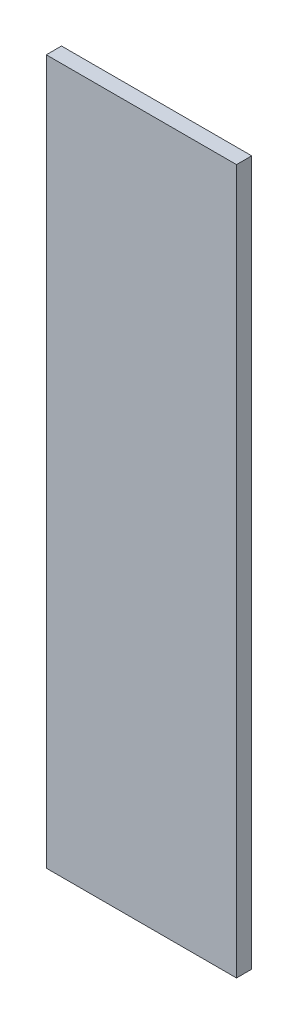
ISO-10303-21;
HEADER;
FILE_DESCRIPTION(('STEP AP214'),'2;1');
FILE_NAME('part.step','',(''),(''),'','','');
FILE_SCHEMA(('AUTOMOTIVE_DESIGN { 1 0 10303 214 1 1 1 1 }'));
ENDSEC;
DATA;
#1=APPLICATION_CONTEXT('core data for automotive mechanical design processes');
#2=APPLICATION_PROTOCOL_DEFINITION('international standard','automotive_design',2000,#1);
#3=PRODUCT_CONTEXT('',#1,'mechanical');
#4=PRODUCT('Part','Part','',(#3));
#5=PRODUCT_RELATED_PRODUCT_CATEGORY('part','',(#4));
#6=PRODUCT_DEFINITION_FORMATION('','',#4);
#7=PRODUCT_DEFINITION_CONTEXT('part definition',#1,'design');
#8=PRODUCT_DEFINITION('design','',#6,#7);
#9=PRODUCT_DEFINITION_SHAPE('','',#8);
#10=(LENGTH_UNIT() NAMED_UNIT(*) SI_UNIT(.MILLI.,.METRE.));
#11=(NAMED_UNIT(*) PLANE_ANGLE_UNIT() SI_UNIT($,.RADIAN.));
#12=(NAMED_UNIT(*) SI_UNIT($,.STERADIAN.) SOLID_ANGLE_UNIT());
#13=UNCERTAINTY_MEASURE_WITH_UNIT(LENGTH_MEASURE(1.E-05),#10,'distance_accuracy_value','');
#14=(GEOMETRIC_REPRESENTATION_CONTEXT(3) GLOBAL_UNCERTAINTY_ASSIGNED_CONTEXT((#13)) GLOBAL_UNIT_ASSIGNED_CONTEXT((#10,
#11,#12)) REPRESENTATION_CONTEXT('',''));
#15=CARTESIAN_POINT('',(0.,0.,0.));
#16=DIRECTION('',(0.,0.,1.));
#17=DIRECTION('',(1.,0.,0.));
#18=AXIS2_PLACEMENT_3D('',#15,#16,#17);
#19=CARTESIAN_POINT('',(12.5,-46.29,2.));
#20=DIRECTION('',(-1.,0.,0.));
#21=DIRECTION('',(0.,0.,1.));
#22=AXIS2_PLACEMENT_3D('',#19,#20,#21);
#23=PLANE('',#22);
#24=DIRECTION('',(0.,1.,0.));
#25=VECTOR('',#24,1.);
#26=CARTESIAN_POINT('',(12.5,-46.29,0.));
#27=LINE('',#26,#25);
#28=CARTESIAN_POINT('',(12.5,-46.29,0.));
#29=VERTEX_POINT('',#28);
#30=CARTESIAN_POINT('',(12.5,46.29,0.));
#31=VERTEX_POINT('',#30);
#32=EDGE_CURVE('E100',#29,#31,#27,.T.);
#33=ORIENTED_EDGE('',*,*,#32,.T.);
#34=DIRECTION('',(0.,0.,-1.));
#35=VECTOR('',#34,1.);
#36=CARTESIAN_POINT('',(12.5,46.29,2.));
#37=LINE('',#36,#35);
#38=CARTESIAN_POINT('',(12.5,46.29,2.));
#39=VERTEX_POINT('',#38);
#40=EDGE_CURVE('E11',#39,#31,#37,.T.);
#41=ORIENTED_EDGE('',*,*,#40,.F.);
#42=DIRECTION('',(0.,1.,0.));
#43=VECTOR('',#42,1.);
#44=CARTESIAN_POINT('',(12.5,-46.29,2.));
#45=LINE('',#44,#43);
#46=CARTESIAN_POINT('',(12.5,-46.29,2.));
#47=VERTEX_POINT('',#46);
#48=EDGE_CURVE('E88',#47,#39,#45,.T.);
#49=ORIENTED_EDGE('',*,*,#48,.F.);
#50=DIRECTION('',(0.,0.,-1.));
#51=VECTOR('',#50,1.);
#52=CARTESIAN_POINT('',(12.5,-46.29,2.));
#53=LINE('',#52,#51);
#54=EDGE_CURVE('E96',#47,#29,#53,.T.);
#55=ORIENTED_EDGE('',*,*,#54,.T.);
#56=EDGE_LOOP('',(#33,#41,#49,#55));
#57=FACE_BOUND('',#56,.T.);
#58=ADVANCED_FACE('F37',(#57),#23,.F.);
#59=CARTESIAN_POINT('',(-12.5,46.29,2.));
#60=DIRECTION('',(0.,-1.,0.));
#61=DIRECTION('',(0.,0.,-1.));
#62=AXIS2_PLACEMENT_3D('',#59,#60,#61);
#63=PLANE('',#62);
#64=DIRECTION('',(-1.,0.,0.));
#65=VECTOR('',#64,1.);
#66=CARTESIAN_POINT('',(-12.5,46.29,0.));
#67=LINE('',#66,#65);
#68=CARTESIAN_POINT('',(-12.5,46.29,0.));
#69=VERTEX_POINT('',#68);
#70=EDGE_CURVE('E92',#31,#69,#67,.T.);
#71=ORIENTED_EDGE('',*,*,#70,.T.);
#72=DIRECTION('',(0.,0.,-1.));
#73=VECTOR('',#72,1.);
#74=CARTESIAN_POINT('',(-12.5,46.29,2.));
#75=LINE('',#74,#73);
#76=CARTESIAN_POINT('',(-12.5,46.29,2.));
#77=VERTEX_POINT('',#76);
#78=EDGE_CURVE('E45',#77,#69,#75,.T.);
#79=ORIENTED_EDGE('',*,*,#78,.F.);
#80=DIRECTION('',(-1.,0.,0.));
#81=VECTOR('',#80,1.);
#82=CARTESIAN_POINT('',(-12.5,46.29,2.));
#83=LINE('',#82,#81);
#84=EDGE_CURVE('E83',#39,#77,#83,.T.);
#85=ORIENTED_EDGE('',*,*,#84,.F.);
#86=ORIENTED_EDGE('',*,*,#40,.T.);
#87=EDGE_LOOP('',(#71,#79,#85,#86));
#88=FACE_BOUND('',#87,.T.);
#89=ADVANCED_FACE('F91',(#88),#63,.F.);
#90=CARTESIAN_POINT('',(-12.5,-46.29,2.));
#91=DIRECTION('',(1.,0.,0.));
#92=DIRECTION('',(0.,0.,-1.));
#93=AXIS2_PLACEMENT_3D('',#90,#91,#92);
#94=PLANE('',#93);
#95=DIRECTION('',(0.,-1.,0.));
#96=VECTOR('',#95,1.);
#97=CARTESIAN_POINT('',(-12.5,-46.29,0.));
#98=LINE('',#97,#96);
#99=CARTESIAN_POINT('',(-12.5,-46.29,0.));
#100=VERTEX_POINT('',#99);
#101=EDGE_CURVE('E70',#69,#100,#98,.T.);
#102=ORIENTED_EDGE('',*,*,#101,.T.);
#103=DIRECTION('',(0.,0.,-1.));
#104=VECTOR('',#103,1.);
#105=CARTESIAN_POINT('',(-12.5,-46.29,2.));
#106=LINE('',#105,#104);
#107=CARTESIAN_POINT('',(-12.5,-46.29,2.));
#108=VERTEX_POINT('',#107);
#109=EDGE_CURVE('E93',#108,#100,#106,.T.);
#110=ORIENTED_EDGE('',*,*,#109,.F.);
#111=DIRECTION('',(0.,-1.,0.));
#112=VECTOR('',#111,1.);
#113=CARTESIAN_POINT('',(-12.5,-46.29,2.));
#114=LINE('',#113,#112);
#115=EDGE_CURVE('E86',#77,#108,#114,.T.);
#116=ORIENTED_EDGE('',*,*,#115,.F.);
#117=ORIENTED_EDGE('',*,*,#78,.T.);
#118=EDGE_LOOP('',(#102,#110,#116,#117));
#119=FACE_BOUND('',#118,.T.);
#120=ADVANCED_FACE('F94',(#119),#94,.F.);
#121=CARTESIAN_POINT('',(-12.5,-46.29,2.));
#122=DIRECTION('',(0.,1.,0.));
#123=DIRECTION('',(0.,0.,1.));
#124=AXIS2_PLACEMENT_3D('',#121,#122,#123);
#125=PLANE('',#124);
#126=DIRECTION('',(1.,0.,0.));
#127=VECTOR('',#126,1.);
#128=CARTESIAN_POINT('',(-12.5,-46.29,0.));
#129=LINE('',#128,#127);
#130=EDGE_CURVE('E76',#100,#29,#129,.T.);
#131=ORIENTED_EDGE('',*,*,#130,.T.);
#132=ORIENTED_EDGE('',*,*,#54,.F.);
#133=DIRECTION('',(1.,0.,0.));
#134=VECTOR('',#133,1.);
#135=CARTESIAN_POINT('',(-12.5,-46.29,2.));
#136=LINE('',#135,#134);
#137=EDGE_CURVE('E53',#108,#47,#136,.T.);
#138=ORIENTED_EDGE('',*,*,#137,.F.);
#139=ORIENTED_EDGE('',*,*,#109,.T.);
#140=EDGE_LOOP('',(#131,#132,#138,#139));
#141=FACE_BOUND('',#140,.T.);
#142=ADVANCED_FACE('F107',(#141),#125,.F.);
#143=CARTESIAN_POINT('',(0.,0.,2.));
#144=DIRECTION('',(0.,0.,-1.));
#145=DIRECTION('',(-1.,0.,0.));
#146=AXIS2_PLACEMENT_3D('',#143,#144,#145);
#147=PLANE('',#146);
#148=ORIENTED_EDGE('',*,*,#48,.T.);
#149=ORIENTED_EDGE('',*,*,#84,.T.);
#150=ORIENTED_EDGE('',*,*,#115,.T.);
#151=ORIENTED_EDGE('',*,*,#137,.T.);
#152=EDGE_LOOP('',(#148,#149,#150,#151));
#153=FACE_BOUND('',#152,.T.);
#154=ADVANCED_FACE('F84',(#153),#147,.F.);
#155=CARTESIAN_POINT('',(0.,0.,0.));
#156=DIRECTION('',(0.,0.,-1.));
#157=DIRECTION('',(-1.,0.,0.));
#158=AXIS2_PLACEMENT_3D('',#155,#156,#157);
#159=PLANE('',#158);
#160=ORIENTED_EDGE('',*,*,#32,.F.);
#161=ORIENTED_EDGE('',*,*,#130,.F.);
#162=ORIENTED_EDGE('',*,*,#101,.F.);
#163=ORIENTED_EDGE('',*,*,#70,.F.);
#164=EDGE_LOOP('',(#160,#161,#162,#163));
#165=FACE_BOUND('',#164,.T.);
#166=ADVANCED_FACE('F110',(#165),#159,.T.);
#167=CLOSED_SHELL('',(#58,#89,#120,#142,#154,#166));
#168=MANIFOLD_SOLID_BREP('B2',#167);
#169=ADVANCED_BREP_SHAPE_REPRESENTATION('',(#18,#168),#14);
#170=SHAPE_DEFINITION_REPRESENTATION(#9,#169);
ENDSEC;
END-ISO-10303-21;
